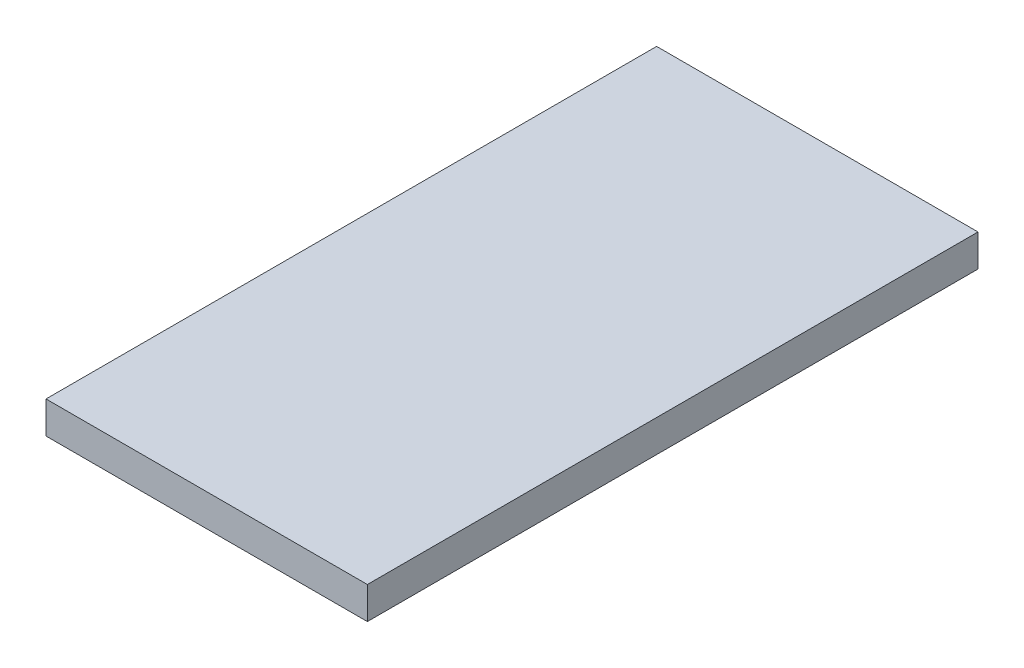
ISO-10303-21;
HEADER;
FILE_DESCRIPTION(('STEP AP214'),'2;1');
FILE_NAME('part.step','',(''),(''),'','','');
FILE_SCHEMA(('AUTOMOTIVE_DESIGN { 1 0 10303 214 1 1 1 1 }'));
ENDSEC;
DATA;
#1=APPLICATION_CONTEXT('core data for automotive mechanical design processes');
#2=APPLICATION_PROTOCOL_DEFINITION('international standard','automotive_design',2000,#1);
#3=PRODUCT_CONTEXT('',#1,'mechanical');
#4=PRODUCT('Part','Part','',(#3));
#5=PRODUCT_RELATED_PRODUCT_CATEGORY('part','',(#4));
#6=PRODUCT_DEFINITION_FORMATION('','',#4);
#7=PRODUCT_DEFINITION_CONTEXT('part definition',#1,'design');
#8=PRODUCT_DEFINITION('design','',#6,#7);
#9=PRODUCT_DEFINITION_SHAPE('','',#8);
#10=(LENGTH_UNIT() NAMED_UNIT(*) SI_UNIT(.MILLI.,.METRE.));
#11=(NAMED_UNIT(*) PLANE_ANGLE_UNIT() SI_UNIT($,.RADIAN.));
#12=(NAMED_UNIT(*) SI_UNIT($,.STERADIAN.) SOLID_ANGLE_UNIT());
#13=UNCERTAINTY_MEASURE_WITH_UNIT(LENGTH_MEASURE(1.E-05),#10,'distance_accuracy_value','');
#14=(GEOMETRIC_REPRESENTATION_CONTEXT(3) GLOBAL_UNCERTAINTY_ASSIGNED_CONTEXT((#13)) GLOBAL_UNIT_ASSIGNED_CONTEXT((#10,
#11,#12)) REPRESENTATION_CONTEXT('',''));
#15=CARTESIAN_POINT('',(0.,0.,0.));
#16=DIRECTION('',(0.,0.,1.));
#17=DIRECTION('',(1.,0.,0.));
#18=AXIS2_PLACEMENT_3D('',#15,#16,#17);
#19=CARTESIAN_POINT('',(0.,5.08,0.));
#20=DIRECTION('',(1.,0.,0.));
#21=DIRECTION('',(0.,0.,-1.));
#22=AXIS2_PLACEMENT_3D('',#19,#20,#21);
#23=PLANE('',#22);
#24=DIRECTION('',(0.,0.,1.));
#25=VECTOR('',#24,1.);
#26=CARTESIAN_POINT('',(0.,0.,0.));
#27=LINE('',#26,#25);
#28=CARTESIAN_POINT('',(0.,0.,-96.52));
#29=VERTEX_POINT('',#28);
#30=CARTESIAN_POINT('',(0.,0.,0.));
#31=VERTEX_POINT('',#30);
#32=EDGE_CURVE('E102',#29,#31,#27,.T.);
#33=ORIENTED_EDGE('',*,*,#32,.T.);
#34=DIRECTION('',(0.,-1.,0.));
#35=VECTOR('',#34,1.);
#36=CARTESIAN_POINT('',(0.,5.08,0.));
#37=LINE('',#36,#35);
#38=CARTESIAN_POINT('',(0.,5.08,0.));
#39=VERTEX_POINT('',#38);
#40=EDGE_CURVE('E11',#39,#31,#37,.T.);
#41=ORIENTED_EDGE('',*,*,#40,.F.);
#42=DIRECTION('',(0.,0.,1.));
#43=VECTOR('',#42,1.);
#44=CARTESIAN_POINT('',(0.,5.08,0.));
#45=LINE('',#44,#43);
#46=CARTESIAN_POINT('',(0.,5.08,-96.52));
#47=VERTEX_POINT('',#46);
#48=EDGE_CURVE('E90',#47,#39,#45,.T.);
#49=ORIENTED_EDGE('',*,*,#48,.F.);
#50=DIRECTION('',(0.,-1.,0.));
#51=VECTOR('',#50,1.);
#52=CARTESIAN_POINT('',(0.,5.08,-96.52));
#53=LINE('',#52,#51);
#54=EDGE_CURVE('E98',#47,#29,#53,.T.);
#55=ORIENTED_EDGE('',*,*,#54,.T.);
#56=EDGE_LOOP('',(#33,#41,#49,#55));
#57=FACE_BOUND('',#56,.T.);
#58=ADVANCED_FACE('F39',(#57),#23,.F.);
#59=CARTESIAN_POINT('',(0.,5.08,0.));
#60=DIRECTION('',(0.,0.,-1.));
#61=DIRECTION('',(-1.,0.,0.));
#62=AXIS2_PLACEMENT_3D('',#59,#60,#61);
#63=PLANE('',#62);
#64=DIRECTION('',(1.,0.,0.));
#65=VECTOR('',#64,1.);
#66=CARTESIAN_POINT('',(0.,0.,0.));
#67=LINE('',#66,#65);
#68=CARTESIAN_POINT('',(50.8,0.,0.));
#69=VERTEX_POINT('',#68);
#70=EDGE_CURVE('E94',#31,#69,#67,.T.);
#71=ORIENTED_EDGE('',*,*,#70,.T.);
#72=DIRECTION('',(0.,-1.,0.));
#73=VECTOR('',#72,1.);
#74=CARTESIAN_POINT('',(50.8,5.08,0.));
#75=LINE('',#74,#73);
#76=CARTESIAN_POINT('',(50.8,5.08,0.));
#77=VERTEX_POINT('',#76);
#78=EDGE_CURVE('E47',#77,#69,#75,.T.);
#79=ORIENTED_EDGE('',*,*,#78,.F.);
#80=DIRECTION('',(1.,0.,0.));
#81=VECTOR('',#80,1.);
#82=CARTESIAN_POINT('',(0.,5.08,0.));
#83=LINE('',#82,#81);
#84=EDGE_CURVE('E85',#39,#77,#83,.T.);
#85=ORIENTED_EDGE('',*,*,#84,.F.);
#86=ORIENTED_EDGE('',*,*,#40,.T.);
#87=EDGE_LOOP('',(#71,#79,#85,#86));
#88=FACE_BOUND('',#87,.T.);
#89=ADVANCED_FACE('F93',(#88),#63,.F.);
#90=CARTESIAN_POINT('',(50.8,5.08,0.));
#91=DIRECTION('',(-1.,0.,0.));
#92=DIRECTION('',(0.,0.,1.));
#93=AXIS2_PLACEMENT_3D('',#90,#91,#92);
#94=PLANE('',#93);
#95=DIRECTION('',(0.,0.,-1.));
#96=VECTOR('',#95,1.);
#97=CARTESIAN_POINT('',(50.8,0.,0.));
#98=LINE('',#97,#96);
#99=CARTESIAN_POINT('',(50.8,0.,-96.52));
#100=VERTEX_POINT('',#99);
#101=EDGE_CURVE('E72',#69,#100,#98,.T.);
#102=ORIENTED_EDGE('',*,*,#101,.T.);
#103=DIRECTION('',(0.,-1.,0.));
#104=VECTOR('',#103,1.);
#105=CARTESIAN_POINT('',(50.8,5.08,-96.52));
#106=LINE('',#105,#104);
#107=CARTESIAN_POINT('',(50.8,5.08,-96.52));
#108=VERTEX_POINT('',#107);
#109=EDGE_CURVE('E95',#108,#100,#106,.T.);
#110=ORIENTED_EDGE('',*,*,#109,.F.);
#111=DIRECTION('',(0.,0.,-1.));
#112=VECTOR('',#111,1.);
#113=CARTESIAN_POINT('',(50.8,5.08,0.));
#114=LINE('',#113,#112);
#115=EDGE_CURVE('E88',#77,#108,#114,.T.);
#116=ORIENTED_EDGE('',*,*,#115,.F.);
#117=ORIENTED_EDGE('',*,*,#78,.T.);
#118=EDGE_LOOP('',(#102,#110,#116,#117));
#119=FACE_BOUND('',#118,.T.);
#120=ADVANCED_FACE('F96',(#119),#94,.F.);
#121=CARTESIAN_POINT('',(0.,5.08,-96.52));
#122=DIRECTION('',(0.,0.,1.));
#123=DIRECTION('',(1.,0.,0.));
#124=AXIS2_PLACEMENT_3D('',#121,#122,#123);
#125=PLANE('',#124);
#126=DIRECTION('',(-1.,0.,0.));
#127=VECTOR('',#126,1.);
#128=CARTESIAN_POINT('',(0.,0.,-96.52));
#129=LINE('',#128,#127);
#130=EDGE_CURVE('E78',#100,#29,#129,.T.);
#131=ORIENTED_EDGE('',*,*,#130,.T.);
#132=ORIENTED_EDGE('',*,*,#54,.F.);
#133=DIRECTION('',(-1.,0.,0.));
#134=VECTOR('',#133,1.);
#135=CARTESIAN_POINT('',(0.,5.08,-96.52));
#136=LINE('',#135,#134);
#137=EDGE_CURVE('E55',#108,#47,#136,.T.);
#138=ORIENTED_EDGE('',*,*,#137,.F.);
#139=ORIENTED_EDGE('',*,*,#109,.T.);
#140=EDGE_LOOP('',(#131,#132,#138,#139));
#141=FACE_BOUND('',#140,.T.);
#142=ADVANCED_FACE('F109',(#141),#125,.F.);
#143=CARTESIAN_POINT('',(0.,5.08,0.));
#144=DIRECTION('',(0.,-1.,0.));
#145=DIRECTION('',(0.,0.,-1.));
#146=AXIS2_PLACEMENT_3D('',#143,#144,#145);
#147=PLANE('',#146);
#148=ORIENTED_EDGE('',*,*,#48,.T.);
#149=ORIENTED_EDGE('',*,*,#84,.T.);
#150=ORIENTED_EDGE('',*,*,#115,.T.);
#151=ORIENTED_EDGE('',*,*,#137,.T.);
#152=EDGE_LOOP('',(#148,#149,#150,#151));
#153=FACE_BOUND('',#152,.T.);
#154=ADVANCED_FACE('F86',(#153),#147,.F.);
#155=CARTESIAN_POINT('',(0.,0.,0.));
#156=DIRECTION('',(0.,-1.,0.));
#157=DIRECTION('',(0.,0.,-1.));
#158=AXIS2_PLACEMENT_3D('',#155,#156,#157);
#159=PLANE('',#158);
#160=ORIENTED_EDGE('',*,*,#32,.F.);
#161=ORIENTED_EDGE('',*,*,#130,.F.);
#162=ORIENTED_EDGE('',*,*,#101,.F.);
#163=ORIENTED_EDGE('',*,*,#70,.F.);
#164=EDGE_LOOP('',(#160,#161,#162,#163));
#165=FACE_BOUND('',#164,.T.);
#166=ADVANCED_FACE('F112',(#165),#159,.T.);
#167=CLOSED_SHELL('',(#58,#89,#120,#142,#154,#166));
#168=MANIFOLD_SOLID_BREP('B2',#167);
#169=ADVANCED_BREP_SHAPE_REPRESENTATION('',(#18,#168),#14);
#170=SHAPE_DEFINITION_REPRESENTATION(#9,#169);
ENDSEC;
END-ISO-10303-21;
